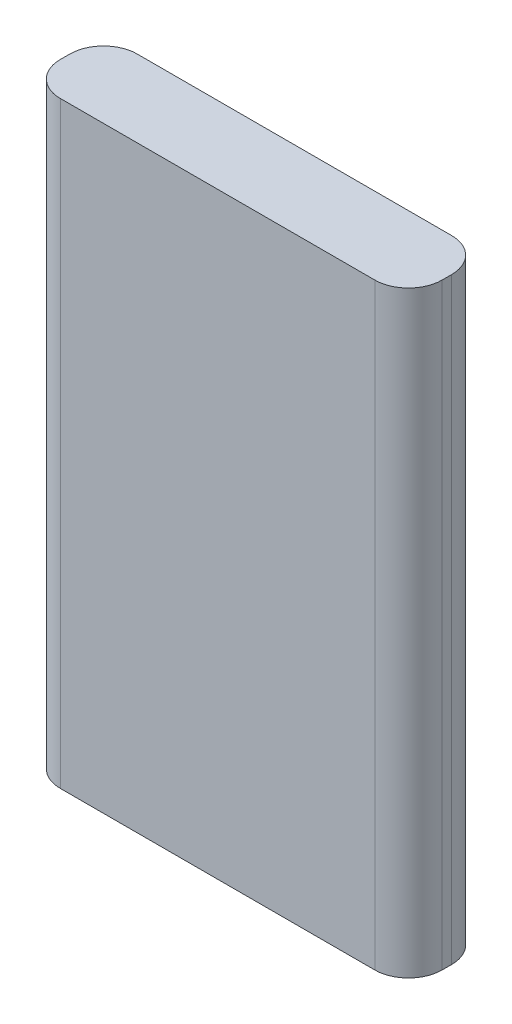
ISO-10303-21;
HEADER;
FILE_DESCRIPTION(('STEP AP214'),'2;1');
FILE_NAME('part.step','',(''),(''),'','','');
FILE_SCHEMA(('AUTOMOTIVE_DESIGN { 1 0 10303 214 1 1 1 1 }'));
ENDSEC;
DATA;
#1=APPLICATION_CONTEXT('core data for automotive mechanical design processes');
#2=APPLICATION_PROTOCOL_DEFINITION('international standard','automotive_design',2000,#1);
#3=PRODUCT_CONTEXT('',#1,'mechanical');
#4=PRODUCT('Part','Part','',(#3));
#5=PRODUCT_RELATED_PRODUCT_CATEGORY('part','',(#4));
#6=PRODUCT_DEFINITION_FORMATION('','',#4);
#7=PRODUCT_DEFINITION_CONTEXT('part definition',#1,'design');
#8=PRODUCT_DEFINITION('design','',#6,#7);
#9=PRODUCT_DEFINITION_SHAPE('','',#8);
#10=(LENGTH_UNIT() NAMED_UNIT(*) SI_UNIT(.MILLI.,.METRE.));
#11=(NAMED_UNIT(*) PLANE_ANGLE_UNIT() SI_UNIT($,.RADIAN.));
#12=(NAMED_UNIT(*) SI_UNIT($,.STERADIAN.) SOLID_ANGLE_UNIT());
#13=UNCERTAINTY_MEASURE_WITH_UNIT(LENGTH_MEASURE(1.E-05),#10,'distance_accuracy_value','');
#14=(GEOMETRIC_REPRESENTATION_CONTEXT(3) GLOBAL_UNCERTAINTY_ASSIGNED_CONTEXT((#13)) GLOBAL_UNIT_ASSIGNED_CONTEXT((#10,
#11,#12)) REPRESENTATION_CONTEXT('',''));
#15=CARTESIAN_POINT('',(0.,0.,0.));
#16=DIRECTION('',(0.,0.,1.));
#17=DIRECTION('',(1.,0.,0.));
#18=AXIS2_PLACEMENT_3D('',#15,#16,#17);
#19=CARTESIAN_POINT('',(14.,53.2,-0.425));
#20=DIRECTION('',(0.,-1.,0.));
#21=DIRECTION('',(0.,0.,-1.));
#22=AXIS2_PLACEMENT_3D('',#19,#20,#21);
#23=CYLINDRICAL_SURFACE('',#22,3.);
#24=CARTESIAN_POINT('',(14.,0.,-0.425));
#25=DIRECTION('',(0.,1.,0.));
#26=DIRECTION('',(0.,0.,-1.));
#27=AXIS2_PLACEMENT_3D('',#24,#25,#26);
#28=CIRCLE('',#27,3.);
#29=CARTESIAN_POINT('',(17.,0.,-0.424999999999979));
#30=VERTEX_POINT('',#29);
#31=CARTESIAN_POINT('',(14.,0.,-3.425));
#32=VERTEX_POINT('',#31);
#33=EDGE_CURVE('E134',#30,#32,#28,.T.);
#34=ORIENTED_EDGE('',*,*,#33,.T.);
#35=DIRECTION('',(0.,-1.,0.));
#36=VECTOR('',#35,1.);
#37=CARTESIAN_POINT('',(14.,53.2,-3.425));
#38=LINE('',#37,#36);
#39=CARTESIAN_POINT('',(14.,53.2,-3.425));
#40=VERTEX_POINT('',#39);
#41=EDGE_CURVE('E11',#40,#32,#38,.T.);
#42=ORIENTED_EDGE('',*,*,#41,.F.);
#43=CARTESIAN_POINT('',(14.,53.2,-0.425));
#44=DIRECTION('',(0.,1.,0.));
#45=DIRECTION('',(0.,0.,-1.));
#46=AXIS2_PLACEMENT_3D('',#43,#44,#45);
#47=CIRCLE('',#46,3.);
#48=CARTESIAN_POINT('',(17.,53.2,-0.424999999999979));
#49=VERTEX_POINT('',#48);
#50=EDGE_CURVE('E146',#49,#40,#47,.T.);
#51=ORIENTED_EDGE('',*,*,#50,.F.);
#52=DIRECTION('',(0.,-1.,0.));
#53=VECTOR('',#52,1.);
#54=CARTESIAN_POINT('',(17.,53.2,-0.424999999999979));
#55=LINE('',#54,#53);
#56=EDGE_CURVE('E131',#49,#30,#55,.T.);
#57=ORIENTED_EDGE('',*,*,#56,.T.);
#58=EDGE_LOOP('',(#34,#42,#51,#57));
#59=FACE_BOUND('',#58,.T.);
#60=ADVANCED_FACE('F39',(#59),#23,.T.);
#61=CARTESIAN_POINT('',(-14.,53.2,-3.425));
#62=DIRECTION('',(0.,0.,1.));
#63=DIRECTION('',(1.,0.,0.));
#64=AXIS2_PLACEMENT_3D('',#61,#62,#63);
#65=PLANE('',#64);
#66=DIRECTION('',(-1.,0.,0.));
#67=VECTOR('',#66,1.);
#68=CARTESIAN_POINT('',(-14.,0.,-3.425));
#69=LINE('',#68,#67);
#70=CARTESIAN_POINT('',(-14.,0.,-3.425));
#71=VERTEX_POINT('',#70);
#72=EDGE_CURVE('E138',#32,#71,#69,.T.);
#73=ORIENTED_EDGE('',*,*,#72,.T.);
#74=DIRECTION('',(0.,-1.,0.));
#75=VECTOR('',#74,1.);
#76=CARTESIAN_POINT('',(-14.,53.2,-3.425));
#77=LINE('',#76,#75);
#78=CARTESIAN_POINT('',(-14.,53.2,-3.425));
#79=VERTEX_POINT('',#78);
#80=EDGE_CURVE('E50',#79,#71,#77,.T.);
#81=ORIENTED_EDGE('',*,*,#80,.F.);
#82=DIRECTION('',(-1.,0.,0.));
#83=VECTOR('',#82,1.);
#84=CARTESIAN_POINT('',(-14.,53.2,-3.425));
#85=LINE('',#84,#83);
#86=EDGE_CURVE('E97',#40,#79,#85,.T.);
#87=ORIENTED_EDGE('',*,*,#86,.F.);
#88=ORIENTED_EDGE('',*,*,#41,.T.);
#89=EDGE_LOOP('',(#73,#81,#87,#88));
#90=FACE_BOUND('',#89,.T.);
#91=ADVANCED_FACE('F182',(#90),#65,.F.);
#92=CARTESIAN_POINT('',(-14.,53.2,-0.425));
#93=DIRECTION('',(0.,-1.,0.));
#94=DIRECTION('',(0.,0.,-1.));
#95=AXIS2_PLACEMENT_3D('',#92,#93,#94);
#96=CYLINDRICAL_SURFACE('',#95,3.);
#97=CARTESIAN_POINT('',(-14.,0.,-0.425));
#98=DIRECTION('',(0.,1.,0.));
#99=DIRECTION('',(0.,0.,-1.));
#100=AXIS2_PLACEMENT_3D('',#97,#98,#99);
#101=CIRCLE('',#100,3.);
#102=CARTESIAN_POINT('',(-17.,0.,-0.424999999999979));
#103=VERTEX_POINT('',#102);
#104=EDGE_CURVE('E139',#71,#103,#101,.T.);
#105=ORIENTED_EDGE('',*,*,#104,.T.);
#106=DIRECTION('',(0.,-1.,0.));
#107=VECTOR('',#106,1.);
#108=CARTESIAN_POINT('',(-17.,53.2,-0.424999999999979));
#109=LINE('',#108,#107);
#110=CARTESIAN_POINT('',(-17.,53.2,-0.424999999999979));
#111=VERTEX_POINT('',#110);
#112=EDGE_CURVE('E157',#111,#103,#109,.T.);
#113=ORIENTED_EDGE('',*,*,#112,.F.);
#114=CARTESIAN_POINT('',(-14.,53.2,-0.425));
#115=DIRECTION('',(0.,1.,0.));
#116=DIRECTION('',(0.,0.,-1.));
#117=AXIS2_PLACEMENT_3D('',#114,#115,#116);
#118=CIRCLE('',#117,3.);
#119=EDGE_CURVE('E165',#79,#111,#118,.T.);
#120=ORIENTED_EDGE('',*,*,#119,.F.);
#121=ORIENTED_EDGE('',*,*,#80,.T.);
#122=EDGE_LOOP('',(#105,#113,#120,#121));
#123=FACE_BOUND('',#122,.T.);
#124=ADVANCED_FACE('F164',(#123),#96,.T.);
#125=CARTESIAN_POINT('',(-17.,53.2,-0.424999999999979));
#126=DIRECTION('',(1.,0.,0.));
#127=DIRECTION('',(0.,0.,-1.));
#128=AXIS2_PLACEMENT_3D('',#125,#126,#127);
#129=PLANE('',#128);
#130=DIRECTION('',(0.,0.,1.));
#131=VECTOR('',#130,1.);
#132=CARTESIAN_POINT('',(-17.,0.,-0.424999999999979));
#133=LINE('',#132,#131);
#134=CARTESIAN_POINT('',(-17.,0.,0.424999999999978));
#135=VERTEX_POINT('',#134);
#136=EDGE_CURVE('E145',#103,#135,#133,.T.);
#137=ORIENTED_EDGE('',*,*,#136,.T.);
#138=DIRECTION('',(0.,-1.,0.));
#139=VECTOR('',#138,1.);
#140=CARTESIAN_POINT('',(-17.,53.2,0.424999999999978));
#141=LINE('',#140,#139);
#142=CARTESIAN_POINT('',(-17.,53.2,0.424999999999978));
#143=VERTEX_POINT('',#142);
#144=EDGE_CURVE('E152',#143,#135,#141,.T.);
#145=ORIENTED_EDGE('',*,*,#144,.F.);
#146=DIRECTION('',(0.,0.,1.));
#147=VECTOR('',#146,1.);
#148=CARTESIAN_POINT('',(-17.,53.2,-0.424999999999979));
#149=LINE('',#148,#147);
#150=EDGE_CURVE('E176',#111,#143,#149,.T.);
#151=ORIENTED_EDGE('',*,*,#150,.F.);
#152=ORIENTED_EDGE('',*,*,#112,.T.);
#153=EDGE_LOOP('',(#137,#145,#151,#152));
#154=FACE_BOUND('',#153,.T.);
#155=ADVANCED_FACE('F175',(#154),#129,.F.);
#156=CARTESIAN_POINT('',(-14.,53.2,0.425));
#157=DIRECTION('',(0.,-1.,0.));
#158=DIRECTION('',(0.,0.,-1.));
#159=AXIS2_PLACEMENT_3D('',#156,#157,#158);
#160=CYLINDRICAL_SURFACE('',#159,3.);
#161=CARTESIAN_POINT('',(-14.,0.,0.425));
#162=DIRECTION('',(0.,1.,0.));
#163=DIRECTION('',(0.,0.,1.));
#164=AXIS2_PLACEMENT_3D('',#161,#162,#163);
#165=CIRCLE('',#164,3.);
#166=CARTESIAN_POINT('',(-14.,0.,3.425));
#167=VERTEX_POINT('',#166);
#168=EDGE_CURVE('E143',#135,#167,#165,.T.);
#169=ORIENTED_EDGE('',*,*,#168,.T.);
#170=DIRECTION('',(0.,-1.,0.));
#171=VECTOR('',#170,1.);
#172=CARTESIAN_POINT('',(-14.,53.2,3.425));
#173=LINE('',#172,#171);
#174=CARTESIAN_POINT('',(-14.,53.2,3.425));
#175=VERTEX_POINT('',#174);
#176=EDGE_CURVE('E128',#175,#167,#173,.T.);
#177=ORIENTED_EDGE('',*,*,#176,.F.);
#178=CARTESIAN_POINT('',(-14.,53.2,0.425));
#179=DIRECTION('',(0.,1.,0.));
#180=DIRECTION('',(0.,0.,1.));
#181=AXIS2_PLACEMENT_3D('',#178,#179,#180);
#182=CIRCLE('',#181,3.);
#183=EDGE_CURVE('E119',#143,#175,#182,.T.);
#184=ORIENTED_EDGE('',*,*,#183,.F.);
#185=ORIENTED_EDGE('',*,*,#144,.T.);
#186=EDGE_LOOP('',(#169,#177,#184,#185));
#187=FACE_BOUND('',#186,.T.);
#188=ADVANCED_FACE('F172',(#187),#160,.T.);
#189=CARTESIAN_POINT('',(-14.,53.2,3.425));
#190=DIRECTION('',(0.,0.,-1.));
#191=DIRECTION('',(-1.,0.,0.));
#192=AXIS2_PLACEMENT_3D('',#189,#190,#191);
#193=PLANE('',#192);
#194=DIRECTION('',(1.,0.,0.));
#195=VECTOR('',#194,1.);
#196=CARTESIAN_POINT('',(-14.,0.,3.425));
#197=LINE('',#196,#195);
#198=CARTESIAN_POINT('',(14.,0.,3.425));
#199=VERTEX_POINT('',#198);
#200=EDGE_CURVE('E124',#167,#199,#197,.T.);
#201=ORIENTED_EDGE('',*,*,#200,.T.);
#202=DIRECTION('',(0.,-1.,0.));
#203=VECTOR('',#202,1.);
#204=CARTESIAN_POINT('',(14.,53.2,3.425));
#205=LINE('',#204,#203);
#206=CARTESIAN_POINT('',(14.,53.2,3.425));
#207=VERTEX_POINT('',#206);
#208=EDGE_CURVE('E122',#207,#199,#205,.T.);
#209=ORIENTED_EDGE('',*,*,#208,.F.);
#210=DIRECTION('',(1.,0.,0.));
#211=VECTOR('',#210,1.);
#212=CARTESIAN_POINT('',(-14.,53.2,3.425));
#213=LINE('',#212,#211);
#214=EDGE_CURVE('E112',#175,#207,#213,.T.);
#215=ORIENTED_EDGE('',*,*,#214,.F.);
#216=ORIENTED_EDGE('',*,*,#176,.T.);
#217=EDGE_LOOP('',(#201,#209,#215,#216));
#218=FACE_BOUND('',#217,.T.);
#219=ADVANCED_FACE('F121',(#218),#193,.F.);
#220=CARTESIAN_POINT('',(14.,53.2,0.425));
#221=DIRECTION('',(0.,-1.,0.));
#222=DIRECTION('',(0.,0.,-1.));
#223=AXIS2_PLACEMENT_3D('',#220,#221,#222);
#224=CYLINDRICAL_SURFACE('',#223,3.);
#225=CARTESIAN_POINT('',(14.,0.,0.425));
#226=DIRECTION('',(0.,1.,0.));
#227=DIRECTION('',(0.,0.,1.));
#228=AXIS2_PLACEMENT_3D('',#225,#226,#227);
#229=CIRCLE('',#228,3.);
#230=CARTESIAN_POINT('',(17.,0.,0.424999999999978));
#231=VERTEX_POINT('',#230);
#232=EDGE_CURVE('E84',#199,#231,#229,.T.);
#233=ORIENTED_EDGE('',*,*,#232,.T.);
#234=DIRECTION('',(0.,-1.,0.));
#235=VECTOR('',#234,1.);
#236=CARTESIAN_POINT('',(17.,53.2,0.424999999999978));
#237=LINE('',#236,#235);
#238=CARTESIAN_POINT('',(17.,53.2,0.424999999999978));
#239=VERTEX_POINT('',#238);
#240=EDGE_CURVE('E130',#239,#231,#237,.T.);
#241=ORIENTED_EDGE('',*,*,#240,.F.);
#242=CARTESIAN_POINT('',(14.,53.2,0.425));
#243=DIRECTION('',(0.,1.,0.));
#244=DIRECTION('',(0.,0.,1.));
#245=AXIS2_PLACEMENT_3D('',#242,#243,#244);
#246=CIRCLE('',#245,3.);
#247=EDGE_CURVE('E113',#207,#239,#246,.T.);
#248=ORIENTED_EDGE('',*,*,#247,.F.);
#249=ORIENTED_EDGE('',*,*,#208,.T.);
#250=EDGE_LOOP('',(#233,#241,#248,#249));
#251=FACE_BOUND('',#250,.T.);
#252=ADVANCED_FACE('F129',(#251),#224,.T.);
#253=CARTESIAN_POINT('',(17.,53.2,-0.424999999999979));
#254=DIRECTION('',(-1.,0.,0.));
#255=DIRECTION('',(0.,0.,1.));
#256=AXIS2_PLACEMENT_3D('',#253,#254,#255);
#257=PLANE('',#256);
#258=DIRECTION('',(0.,0.,-1.));
#259=VECTOR('',#258,1.);
#260=CARTESIAN_POINT('',(17.,0.,-0.424999999999979));
#261=LINE('',#260,#259);
#262=EDGE_CURVE('E89',#231,#30,#261,.T.);
#263=ORIENTED_EDGE('',*,*,#262,.T.);
#264=ORIENTED_EDGE('',*,*,#56,.F.);
#265=DIRECTION('',(0.,0.,-1.));
#266=VECTOR('',#265,1.);
#267=CARTESIAN_POINT('',(17.,53.2,-0.424999999999979));
#268=LINE('',#267,#266);
#269=EDGE_CURVE('E54',#239,#49,#268,.T.);
#270=ORIENTED_EDGE('',*,*,#269,.F.);
#271=ORIENTED_EDGE('',*,*,#240,.T.);
#272=EDGE_LOOP('',(#263,#264,#270,#271));
#273=FACE_BOUND('',#272,.T.);
#274=ADVANCED_FACE('F196',(#273),#257,.F.);
#275=CARTESIAN_POINT('',(14.,53.2,-0.425));
#276=DIRECTION('',(0.,-1.,0.));
#277=DIRECTION('',(0.,0.,-1.));
#278=AXIS2_PLACEMENT_3D('',#275,#276,#277);
#279=PLANE('',#278);
#280=ORIENTED_EDGE('',*,*,#50,.T.);
#281=ORIENTED_EDGE('',*,*,#86,.T.);
#282=ORIENTED_EDGE('',*,*,#119,.T.);
#283=ORIENTED_EDGE('',*,*,#150,.T.);
#284=ORIENTED_EDGE('',*,*,#183,.T.);
#285=ORIENTED_EDGE('',*,*,#214,.T.);
#286=ORIENTED_EDGE('',*,*,#247,.T.);
#287=ORIENTED_EDGE('',*,*,#269,.T.);
#288=EDGE_LOOP('',(#280,#281,#282,#283,#284,#285,#286,#287));
#289=FACE_BOUND('',#288,.T.);
#290=ADVANCED_FACE('F111',(#289),#279,.F.);
#291=CARTESIAN_POINT('',(14.,0.,-0.425));
#292=DIRECTION('',(0.,-1.,0.));
#293=DIRECTION('',(0.,0.,-1.));
#294=AXIS2_PLACEMENT_3D('',#291,#292,#293);
#295=PLANE('',#294);
#296=ORIENTED_EDGE('',*,*,#33,.F.);
#297=ORIENTED_EDGE('',*,*,#262,.F.);
#298=ORIENTED_EDGE('',*,*,#232,.F.);
#299=ORIENTED_EDGE('',*,*,#200,.F.);
#300=ORIENTED_EDGE('',*,*,#168,.F.);
#301=ORIENTED_EDGE('',*,*,#136,.F.);
#302=ORIENTED_EDGE('',*,*,#104,.F.);
#303=ORIENTED_EDGE('',*,*,#72,.F.);
#304=EDGE_LOOP('',(#296,#297,#298,#299,#300,#301,#302,#303));
#305=FACE_BOUND('',#304,.T.);
#306=ADVANCED_FACE('F166',(#305),#295,.T.);
#307=CLOSED_SHELL('',(#60,#91,#124,#155,#188,#219,#252,#274,#290,#306));
#308=MANIFOLD_SOLID_BREP('B2',#307);
#309=ADVANCED_BREP_SHAPE_REPRESENTATION('',(#18,#308),#14);
#310=SHAPE_DEFINITION_REPRESENTATION(#9,#309);
ENDSEC;
END-ISO-10303-21;
